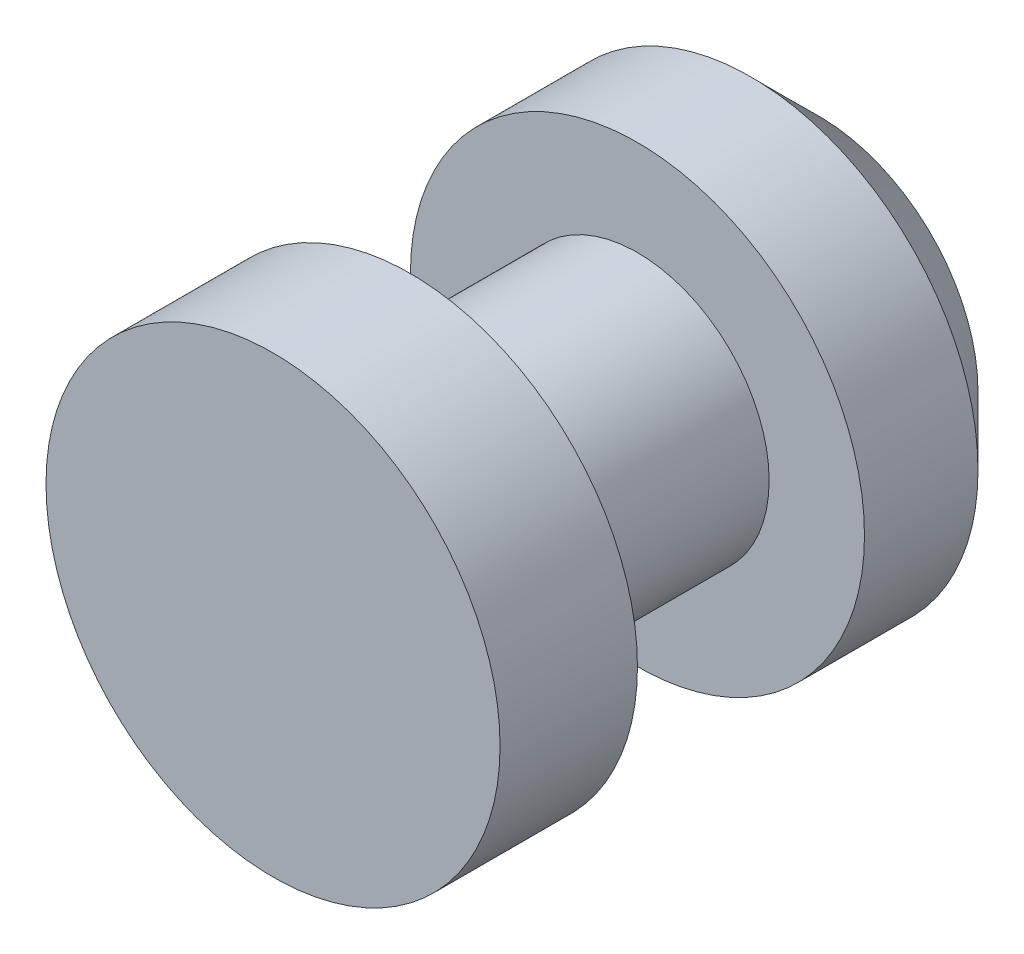
ISO-10303-21;
HEADER;
FILE_DESCRIPTION(('STEP AP214'),'2;1');
FILE_NAME('part.step','',(''),(''),'','','');
FILE_SCHEMA(('AUTOMOTIVE_DESIGN { 1 0 10303 214 1 1 1 1 }'));
ENDSEC;
DATA;
#1=APPLICATION_CONTEXT('core data for automotive mechanical design processes');
#2=APPLICATION_PROTOCOL_DEFINITION('international standard','automotive_design',2000,#1);
#3=PRODUCT_CONTEXT('',#1,'mechanical');
#4=PRODUCT('Part','Part','',(#3));
#5=PRODUCT_RELATED_PRODUCT_CATEGORY('part','',(#4));
#6=PRODUCT_DEFINITION_FORMATION('','',#4);
#7=PRODUCT_DEFINITION_CONTEXT('part definition',#1,'design');
#8=PRODUCT_DEFINITION('design','',#6,#7);
#9=PRODUCT_DEFINITION_SHAPE('','',#8);
#10=(LENGTH_UNIT() NAMED_UNIT(*) SI_UNIT(.MILLI.,.METRE.));
#11=(NAMED_UNIT(*) PLANE_ANGLE_UNIT() SI_UNIT($,.RADIAN.));
#12=(NAMED_UNIT(*) SI_UNIT($,.STERADIAN.) SOLID_ANGLE_UNIT());
#13=UNCERTAINTY_MEASURE_WITH_UNIT(LENGTH_MEASURE(1.E-05),#10,'distance_accuracy_value','');
#14=(GEOMETRIC_REPRESENTATION_CONTEXT(3) GLOBAL_UNCERTAINTY_ASSIGNED_CONTEXT((#13)) GLOBAL_UNIT_ASSIGNED_CONTEXT((#10,
#11,#12)) REPRESENTATION_CONTEXT('',''));
#15=CARTESIAN_POINT('',(0.,0.,0.));
#16=DIRECTION('',(0.,0.,1.));
#17=DIRECTION('',(1.,0.,0.));
#18=AXIS2_PLACEMENT_3D('',#15,#16,#17);
#19=CARTESIAN_POINT('',(-0.35,0.,-0.65));
#20=DIRECTION('',(0.,0.,1.));
#21=DIRECTION('',(1.,0.,0.));
#22=AXIS2_PLACEMENT_3D('',#19,#20,#21);
#23=PLANE('',#22);
#24=CARTESIAN_POINT('',(0.,0.,-0.65));
#25=DIRECTION('',(0.,0.,1.));
#26=DIRECTION('',(1.,0.,0.));
#27=AXIS2_PLACEMENT_3D('',#24,#25,#26);
#28=CIRCLE('',#27,0.35);
#29=CARTESIAN_POINT('',(0.35,0.,-0.65));
#30=VERTEX_POINT('',#29);
#31=EDGE_CURVE('E10',#30,#30,#28,.T.);
#32=ORIENTED_EDGE('',*,*,#31,.F.);
#33=EDGE_LOOP('',(#32));
#34=FACE_BOUND('',#33,.T.);
#35=ADVANCED_FACE('F32',(#34),#23,.F.);
#36=CARTESIAN_POINT('',(0.,0.,-0.65));
#37=DIRECTION('',(0.,0.,1.));
#38=DIRECTION('',(1.,0.,0.));
#39=AXIS2_PLACEMENT_3D('',#36,#37,#38);
#40=CONICAL_SURFACE('',#39,0.35,0.785398163397449);
#41=CARTESIAN_POINT('',(0.,0.,-0.5));
#42=DIRECTION('',(0.,0.,1.));
#43=DIRECTION('',(1.,0.,0.));
#44=AXIS2_PLACEMENT_3D('',#41,#42,#43);
#45=CIRCLE('',#44,0.5);
#46=CARTESIAN_POINT('',(0.5,0.,-0.5));
#47=VERTEX_POINT('',#46);
#48=EDGE_CURVE('E38',#47,#47,#45,.T.);
#49=ORIENTED_EDGE('',*,*,#48,.F.);
#50=EDGE_LOOP('',(#49));
#51=FACE_BOUND('',#50,.T.);
#52=ORIENTED_EDGE('',*,*,#31,.T.);
#53=EDGE_LOOP('',(#52));
#54=FACE_BOUND('',#53,.T.);
#55=ADVANCED_FACE('F89',(#51,#54),#40,.T.);
#56=CARTESIAN_POINT('',(0.,0.,0.552592012274197));
#57=DIRECTION('',(0.,0.,1.));
#58=DIRECTION('',(1.,0.,0.));
#59=AXIS2_PLACEMENT_3D('',#56,#57,#58);
#60=CYLINDRICAL_SURFACE('',#59,0.5);
#61=CARTESIAN_POINT('',(0.,0.,-0.25));
#62=DIRECTION('',(0.,0.,1.));
#63=DIRECTION('',(1.,0.,0.));
#64=AXIS2_PLACEMENT_3D('',#61,#62,#63);
#65=CIRCLE('',#64,0.5);
#66=CARTESIAN_POINT('',(0.5,0.,-0.25));
#67=VERTEX_POINT('',#66);
#68=EDGE_CURVE('E42',#67,#67,#65,.T.);
#69=ORIENTED_EDGE('',*,*,#68,.F.);
#70=EDGE_LOOP('',(#69));
#71=FACE_BOUND('',#70,.T.);
#72=ORIENTED_EDGE('',*,*,#48,.T.);
#73=EDGE_LOOP('',(#72));
#74=FACE_BOUND('',#73,.T.);
#75=ADVANCED_FACE('F84',(#71,#74),#60,.T.);
#76=CARTESIAN_POINT('',(-0.29,0.,-0.25));
#77=DIRECTION('',(0.,0.,-1.));
#78=DIRECTION('',(-1.,0.,0.));
#79=AXIS2_PLACEMENT_3D('',#76,#77,#78);
#80=PLANE('',#79);
#81=CARTESIAN_POINT('',(0.,0.,-0.25));
#82=DIRECTION('',(0.,0.,1.));
#83=DIRECTION('',(1.,0.,0.));
#84=AXIS2_PLACEMENT_3D('',#81,#82,#83);
#85=CIRCLE('',#84,0.29);
#86=CARTESIAN_POINT('',(0.29,0.,-0.25));
#87=VERTEX_POINT('',#86);
#88=EDGE_CURVE('E46',#87,#87,#85,.T.);
#89=ORIENTED_EDGE('',*,*,#88,.F.);
#90=EDGE_LOOP('',(#89));
#91=FACE_BOUND('',#90,.T.);
#92=ORIENTED_EDGE('',*,*,#68,.T.);
#93=EDGE_LOOP('',(#92));
#94=FACE_BOUND('',#93,.T.);
#95=ADVANCED_FACE('F78',(#91,#94),#80,.F.);
#96=CARTESIAN_POINT('',(0.,0.,0.552592012274197));
#97=DIRECTION('',(0.,0.,1.));
#98=DIRECTION('',(1.,0.,0.));
#99=AXIS2_PLACEMENT_3D('',#96,#97,#98);
#100=CYLINDRICAL_SURFACE('',#99,0.29);
#101=CARTESIAN_POINT('',(0.,0.,0.25));
#102=DIRECTION('',(0.,0.,1.));
#103=DIRECTION('',(1.,0.,0.));
#104=AXIS2_PLACEMENT_3D('',#101,#102,#103);
#105=CIRCLE('',#104,0.29);
#106=CARTESIAN_POINT('',(0.29,0.,0.25));
#107=VERTEX_POINT('',#106);
#108=EDGE_CURVE('E51',#107,#107,#105,.T.);
#109=ORIENTED_EDGE('',*,*,#108,.F.);
#110=EDGE_LOOP('',(#109));
#111=FACE_BOUND('',#110,.T.);
#112=ORIENTED_EDGE('',*,*,#88,.T.);
#113=EDGE_LOOP('',(#112));
#114=FACE_BOUND('',#113,.T.);
#115=ADVANCED_FACE('F72',(#111,#114),#100,.T.);
#116=CARTESIAN_POINT('',(-0.29,0.,0.25));
#117=DIRECTION('',(0.,0.,1.));
#118=DIRECTION('',(1.,0.,0.));
#119=AXIS2_PLACEMENT_3D('',#116,#117,#118);
#120=PLANE('',#119);
#121=CARTESIAN_POINT('',(0.,0.,0.25));
#122=DIRECTION('',(0.,0.,1.));
#123=DIRECTION('',(1.,0.,0.));
#124=AXIS2_PLACEMENT_3D('',#121,#122,#123);
#125=CIRCLE('',#124,0.5);
#126=CARTESIAN_POINT('',(0.5,0.,0.25));
#127=VERTEX_POINT('',#126);
#128=EDGE_CURVE('E54',#127,#127,#125,.T.);
#129=ORIENTED_EDGE('',*,*,#128,.F.);
#130=EDGE_LOOP('',(#129));
#131=FACE_BOUND('',#130,.T.);
#132=ORIENTED_EDGE('',*,*,#108,.T.);
#133=EDGE_LOOP('',(#132));
#134=FACE_BOUND('',#133,.T.);
#135=ADVANCED_FACE('F66',(#131,#134),#120,.F.);
#136=CARTESIAN_POINT('',(0.,0.,0.552592012274197));
#137=DIRECTION('',(0.,0.,1.));
#138=DIRECTION('',(1.,0.,0.));
#139=AXIS2_PLACEMENT_3D('',#136,#137,#138);
#140=CYLINDRICAL_SURFACE('',#139,0.5);
#141=CARTESIAN_POINT('',(0.,0.,0.552592012274197));
#142=DIRECTION('',(0.,0.,1.));
#143=DIRECTION('',(1.,0.,0.));
#144=AXIS2_PLACEMENT_3D('',#141,#142,#143);
#145=CIRCLE('',#144,0.5);
#146=CARTESIAN_POINT('',(0.5,0.,0.552592012274197));
#147=VERTEX_POINT('',#146);
#148=EDGE_CURVE('E57',#147,#147,#145,.T.);
#149=ORIENTED_EDGE('',*,*,#148,.F.);
#150=EDGE_LOOP('',(#149));
#151=FACE_BOUND('',#150,.T.);
#152=ORIENTED_EDGE('',*,*,#128,.T.);
#153=EDGE_LOOP('',(#152));
#154=FACE_BOUND('',#153,.T.);
#155=ADVANCED_FACE('F63',(#151,#154),#140,.T.);
#156=CARTESIAN_POINT('',(-0.5,0.,0.552592012274197));
#157=DIRECTION('',(0.,0.,-1.));
#158=DIRECTION('',(-1.,0.,0.));
#159=AXIS2_PLACEMENT_3D('',#156,#157,#158);
#160=PLANE('',#159);
#161=ORIENTED_EDGE('',*,*,#148,.T.);
#162=EDGE_LOOP('',(#161));
#163=FACE_BOUND('',#162,.T.);
#164=ADVANCED_FACE('F61',(#163),#160,.F.);
#165=CLOSED_SHELL('',(#35,#55,#75,#95,#115,#135,#155,#164));
#166=MANIFOLD_SOLID_BREP('B2',#165);
#167=ADVANCED_BREP_SHAPE_REPRESENTATION('',(#18,#166),#14);
#168=SHAPE_DEFINITION_REPRESENTATION(#9,#167);
ENDSEC;
END-ISO-10303-21;
